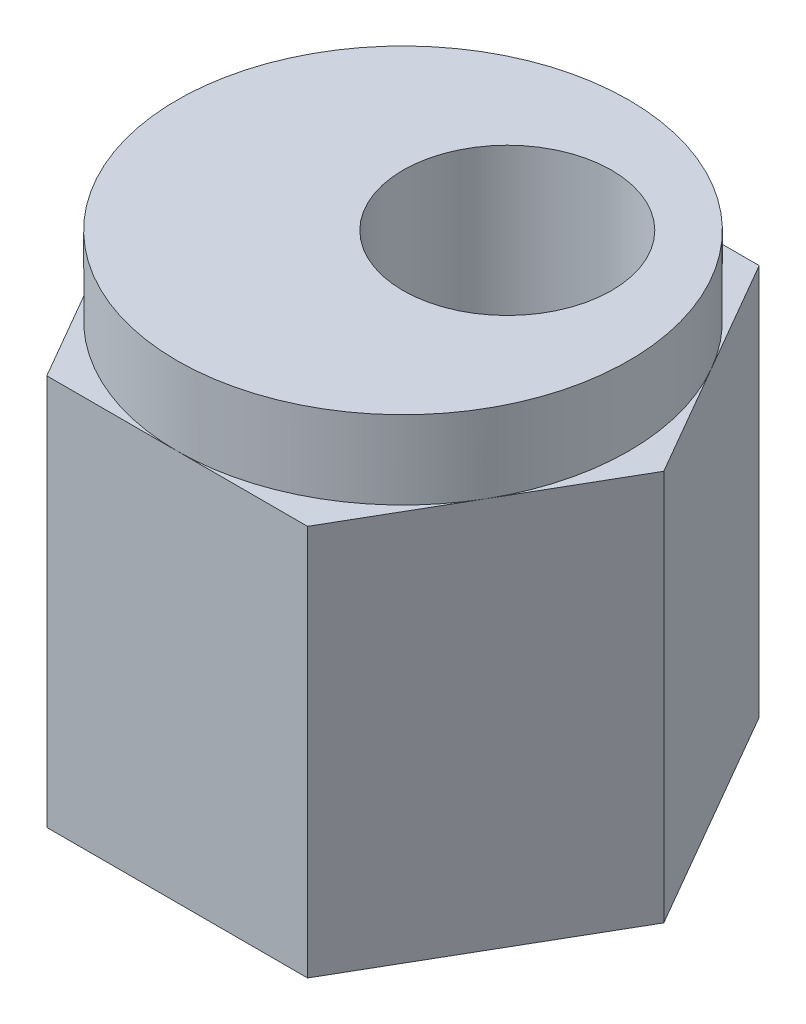
ISO-10303-21;
HEADER;
FILE_DESCRIPTION(('STEP AP214'),'2;1');
FILE_NAME('part.step','',(''),(''),'','','');
FILE_SCHEMA(('AUTOMOTIVE_DESIGN { 1 0 10303 214 1 1 1 1 }'));
ENDSEC;
DATA;
#1=APPLICATION_CONTEXT('core data for automotive mechanical design processes');
#2=APPLICATION_PROTOCOL_DEFINITION('international standard','automotive_design',2000,#1);
#3=PRODUCT_CONTEXT('',#1,'mechanical');
#4=PRODUCT('Part','Part','',(#3));
#5=PRODUCT_RELATED_PRODUCT_CATEGORY('part','',(#4));
#6=PRODUCT_DEFINITION_FORMATION('','',#4);
#7=PRODUCT_DEFINITION_CONTEXT('part definition',#1,'design');
#8=PRODUCT_DEFINITION('design','',#6,#7);
#9=PRODUCT_DEFINITION_SHAPE('','',#8);
#10=(LENGTH_UNIT() NAMED_UNIT(*) SI_UNIT(.MILLI.,.METRE.));
#11=(NAMED_UNIT(*) PLANE_ANGLE_UNIT() SI_UNIT($,.RADIAN.));
#12=(NAMED_UNIT(*) SI_UNIT($,.STERADIAN.) SOLID_ANGLE_UNIT());
#13=UNCERTAINTY_MEASURE_WITH_UNIT(LENGTH_MEASURE(1.E-05),#10,'distance_accuracy_value','');
#14=(GEOMETRIC_REPRESENTATION_CONTEXT(3) GLOBAL_UNCERTAINTY_ASSIGNED_CONTEXT((#13)) GLOBAL_UNIT_ASSIGNED_CONTEXT((#10,
#11,#12)) REPRESENTATION_CONTEXT('',''));
#15=CARTESIAN_POINT('',(0.,0.,0.));
#16=DIRECTION('',(0.,0.,1.));
#17=DIRECTION('',(1.,0.,0.));
#18=AXIS2_PLACEMENT_3D('',#15,#16,#17);
#19=CARTESIAN_POINT('',(0.,18.,0.));
#20=DIRECTION('',(0.,1.,0.));
#21=DIRECTION('',(0.,0.,1.));
#22=AXIS2_PLACEMENT_3D('',#19,#20,#21);
#23=PLANE('',#22);
#24=CARTESIAN_POINT('',(2.,18.,-2.));
#25=DIRECTION('',(0.,1.,0.));
#26=DIRECTION('',(0.,0.,1.));
#27=AXIS2_PLACEMENT_3D('',#24,#25,#26);
#28=CIRCLE('',#27,4.);
#29=CARTESIAN_POINT('',(2.,18.,2.));
#30=VERTEX_POINT('',#29);
#31=EDGE_CURVE('E133',#30,#30,#28,.T.);
#32=ORIENTED_EDGE('',*,*,#31,.F.);
#33=EDGE_LOOP('',(#32));
#34=FACE_BOUND('',#33,.T.);
#35=CARTESIAN_POINT('',(0.,18.,0.));
#36=DIRECTION('',(0.,1.,0.));
#37=DIRECTION('',(0.,0.,1.));
#38=AXIS2_PLACEMENT_3D('',#35,#36,#37);
#39=CIRCLE('',#38,8.66025403784443);
#40=CARTESIAN_POINT('',(0.,18.,8.66025403784443));
#41=VERTEX_POINT('',#40);
#42=EDGE_CURVE('E189',#41,#41,#39,.T.);
#43=ORIENTED_EDGE('',*,*,#42,.T.);
#44=EDGE_LOOP('',(#43));
#45=FACE_BOUND('',#44,.T.);
#46=ADVANCED_FACE('F32',(#34,#45),#23,.T.);
#47=CARTESIAN_POINT('',(5.00000000000009,18.,8.66025403784431));
#48=DIRECTION('',(-0.866025403784442,0.,-0.499999999999995));
#49=DIRECTION('',(-0.499999999999995,0.,0.866025403784442));
#50=AXIS2_PLACEMENT_3D('',#47,#48,#49);
#51=PLANE('',#50);
#52=DIRECTION('',(0.499999999999995,0.,-0.866025403784442));
#53=VECTOR('',#52,1.);
#54=CARTESIAN_POINT('',(5.00000000000009,15.,8.66025403784431));
#55=LINE('',#54,#53);
#56=CARTESIAN_POINT('',(5.00000000000009,15.,8.66025403784431));
#57=VERTEX_POINT('',#56);
#58=CARTESIAN_POINT('',(7.50000000000006,15.,4.33012701892217));
#59=VERTEX_POINT('',#58);
#60=EDGE_CURVE('E102',#57,#59,#55,.T.);
#61=ORIENTED_EDGE('',*,*,#60,.F.);
#62=DIRECTION('',(0.,-1.,0.));
#63=VECTOR('',#62,1.);
#64=CARTESIAN_POINT('',(5.00000000000009,18.,8.66025403784431));
#65=LINE('',#64,#63);
#66=CARTESIAN_POINT('',(5.00000000000009,0.,8.66025403784431));
#67=VERTEX_POINT('',#66);
#68=EDGE_CURVE('E55',#57,#67,#65,.T.);
#69=ORIENTED_EDGE('',*,*,#68,.T.);
#70=DIRECTION('',(0.499999999999995,0.,-0.866025403784441));
#71=VECTOR('',#70,1.);
#72=CARTESIAN_POINT('',(5.00000000000009,0.,8.66025403784431));
#73=LINE('',#72,#71);
#74=CARTESIAN_POINT('',(9.99999999999998,0.,0.));
#75=VERTEX_POINT('',#74);
#76=EDGE_CURVE('E136',#67,#75,#73,.T.);
#77=ORIENTED_EDGE('',*,*,#76,.T.);
#78=DIRECTION('',(0.,-1.,0.));
#79=VECTOR('',#78,1.);
#80=CARTESIAN_POINT('',(9.99999999999998,18.,0.));
#81=LINE('',#80,#79);
#82=CARTESIAN_POINT('',(9.99999999999998,15.,0.));
#83=VERTEX_POINT('',#82);
#84=EDGE_CURVE('E128',#83,#75,#81,.T.);
#85=ORIENTED_EDGE('',*,*,#84,.F.);
#86=EDGE_CURVE('E108',#59,#83,#55,.T.);
#87=ORIENTED_EDGE('',*,*,#86,.F.);
#88=EDGE_LOOP('',(#61,#69,#77,#85,#87));
#89=FACE_BOUND('',#88,.T.);
#90=ADVANCED_FACE('F34',(#89),#51,.F.);
#91=CARTESIAN_POINT('',(9.99999999999998,18.,0.));
#92=DIRECTION('',(-0.866025403784438,0.,0.500000000000001));
#93=DIRECTION('',(0.500000000000001,0.,0.866025403784438));
#94=AXIS2_PLACEMENT_3D('',#91,#92,#93);
#95=PLANE('',#94);
#96=DIRECTION('',(-0.500000000000001,0.,-0.866025403784438));
#97=VECTOR('',#96,1.);
#98=CARTESIAN_POINT('',(9.99999999999998,15.,0.));
#99=LINE('',#98,#97);
#100=CARTESIAN_POINT('',(7.50000000000003,15.,-4.33012701892222));
#101=VERTEX_POINT('',#100);
#102=EDGE_CURVE('E115',#83,#101,#99,.T.);
#103=ORIENTED_EDGE('',*,*,#102,.F.);
#104=ORIENTED_EDGE('',*,*,#84,.T.);
#105=DIRECTION('',(-0.500000000000001,0.,-0.866025403784438));
#106=VECTOR('',#105,1.);
#107=CARTESIAN_POINT('',(9.99999999999998,0.,0.));
#108=LINE('',#107,#106);
#109=CARTESIAN_POINT('',(4.99999999999997,0.,-8.66025403784438));
#110=VERTEX_POINT('',#109);
#111=EDGE_CURVE('E140',#75,#110,#108,.T.);
#112=ORIENTED_EDGE('',*,*,#111,.T.);
#113=DIRECTION('',(0.,-1.,0.));
#114=VECTOR('',#113,1.);
#115=CARTESIAN_POINT('',(4.99999999999997,18.,-8.66025403784438));
#116=LINE('',#115,#114);
#117=CARTESIAN_POINT('',(4.99999999999997,15.,-8.66025403784438));
#118=VERTEX_POINT('',#117);
#119=EDGE_CURVE('E161',#118,#110,#116,.T.);
#120=ORIENTED_EDGE('',*,*,#119,.F.);
#121=EDGE_CURVE('E129',#101,#118,#99,.T.);
#122=ORIENTED_EDGE('',*,*,#121,.F.);
#123=EDGE_LOOP('',(#103,#104,#112,#120,#122));
#124=FACE_BOUND('',#123,.T.);
#125=ADVANCED_FACE('F164',(#124),#95,.F.);
#126=CARTESIAN_POINT('',(4.99999999999997,18.,-8.66025403784438));
#127=DIRECTION('',(0.,0.,1.));
#128=DIRECTION('',(1.,0.,0.));
#129=AXIS2_PLACEMENT_3D('',#126,#127,#128);
#130=PLANE('',#129);
#131=DIRECTION('',(-1.,0.,0.));
#132=VECTOR('',#131,1.);
#133=CARTESIAN_POINT('',(4.99999999999997,15.,-8.66025403784438));
#134=LINE('',#133,#132);
#135=CARTESIAN_POINT('',(0.,15.,-8.66025403784443));
#136=VERTEX_POINT('',#135);
#137=EDGE_CURVE('E179',#118,#136,#134,.T.);
#138=ORIENTED_EDGE('',*,*,#137,.F.);
#139=ORIENTED_EDGE('',*,*,#119,.T.);
#140=DIRECTION('',(-1.,0.,0.));
#141=VECTOR('',#140,1.);
#142=CARTESIAN_POINT('',(4.99999999999997,0.,-8.66025403784438));
#143=LINE('',#142,#141);
#144=CARTESIAN_POINT('',(-5.00000000000003,0.,-8.66025403784435));
#145=VERTEX_POINT('',#144);
#146=EDGE_CURVE('E143',#110,#145,#143,.T.);
#147=ORIENTED_EDGE('',*,*,#146,.T.);
#148=DIRECTION('',(0.,-1.,0.));
#149=VECTOR('',#148,1.);
#150=CARTESIAN_POINT('',(-5.00000000000003,18.,-8.66025403784435));
#151=LINE('',#150,#149);
#152=CARTESIAN_POINT('',(-5.00000000000003,15.,-8.66025403784435));
#153=VERTEX_POINT('',#152);
#154=EDGE_CURVE('E159',#153,#145,#151,.T.);
#155=ORIENTED_EDGE('',*,*,#154,.F.);
#156=EDGE_CURVE('E181',#136,#153,#134,.T.);
#157=ORIENTED_EDGE('',*,*,#156,.F.);
#158=EDGE_LOOP('',(#138,#139,#147,#155,#157));
#159=FACE_BOUND('',#158,.T.);
#160=ADVANCED_FACE('F177',(#159),#130,.F.);
#161=CARTESIAN_POINT('',(-5.00000000000003,18.,-8.66025403784435));
#162=DIRECTION('',(0.866025403784441,0.,0.499999999999995));
#163=DIRECTION('',(0.499999999999995,0.,-0.866025403784442));
#164=AXIS2_PLACEMENT_3D('',#161,#162,#163);
#165=PLANE('',#164);
#166=DIRECTION('',(-0.499999999999995,0.,0.866025403784442));
#167=VECTOR('',#166,1.);
#168=CARTESIAN_POINT('',(-5.00000000000003,15.,-8.66025403784435));
#169=LINE('',#168,#167);
#170=CARTESIAN_POINT('',(-7.50000000000006,15.,-4.33012701892217));
#171=VERTEX_POINT('',#170);
#172=EDGE_CURVE('E183',#153,#171,#169,.T.);
#173=ORIENTED_EDGE('',*,*,#172,.F.);
#174=ORIENTED_EDGE('',*,*,#154,.T.);
#175=DIRECTION('',(-0.499999999999995,0.,0.866025403784442));
#176=VECTOR('',#175,1.);
#177=CARTESIAN_POINT('',(-5.00000000000003,0.,-8.66025403784435));
#178=LINE('',#177,#176);
#179=CARTESIAN_POINT('',(-9.99999999999998,0.,0.));
#180=VERTEX_POINT('',#179);
#181=EDGE_CURVE('E146',#145,#180,#178,.T.);
#182=ORIENTED_EDGE('',*,*,#181,.T.);
#183=DIRECTION('',(0.,-1.,0.));
#184=VECTOR('',#183,1.);
#185=CARTESIAN_POINT('',(-9.99999999999998,18.,0.));
#186=LINE('',#185,#184);
#187=CARTESIAN_POINT('',(-9.99999999999998,15.,0.));
#188=VERTEX_POINT('',#187);
#189=EDGE_CURVE('E157',#188,#180,#186,.T.);
#190=ORIENTED_EDGE('',*,*,#189,.F.);
#191=EDGE_CURVE('E185',#171,#188,#169,.T.);
#192=ORIENTED_EDGE('',*,*,#191,.F.);
#193=EDGE_LOOP('',(#173,#174,#182,#190,#192));
#194=FACE_BOUND('',#193,.T.);
#195=ADVANCED_FACE('F203',(#194),#165,.F.);
#196=CARTESIAN_POINT('',(-9.99999999999998,18.,0.));
#197=DIRECTION('',(0.866025403784434,0.,-0.500000000000007));
#198=DIRECTION('',(-0.500000000000007,0.,-0.866025403784435));
#199=AXIS2_PLACEMENT_3D('',#196,#197,#198);
#200=PLANE('',#199);
#201=DIRECTION('',(0.500000000000007,0.,0.866025403784435));
#202=VECTOR('',#201,1.);
#203=CARTESIAN_POINT('',(-9.99999999999998,15.,0.));
#204=LINE('',#203,#202);
#205=CARTESIAN_POINT('',(-7.5,15.,4.33012701892228));
#206=VERTEX_POINT('',#205);
#207=EDGE_CURVE('E187',#188,#206,#204,.T.);
#208=ORIENTED_EDGE('',*,*,#207,.F.);
#209=ORIENTED_EDGE('',*,*,#189,.T.);
#210=DIRECTION('',(0.500000000000007,0.,0.866025403784434));
#211=VECTOR('',#210,1.);
#212=CARTESIAN_POINT('',(-9.99999999999998,0.,0.));
#213=LINE('',#212,#211);
#214=CARTESIAN_POINT('',(-4.99999999999991,0.,8.66025403784442));
#215=VERTEX_POINT('',#214);
#216=EDGE_CURVE('E149',#180,#215,#213,.T.);
#217=ORIENTED_EDGE('',*,*,#216,.T.);
#218=DIRECTION('',(0.,-1.,0.));
#219=VECTOR('',#218,1.);
#220=CARTESIAN_POINT('',(-4.99999999999991,18.,8.66025403784442));
#221=LINE('',#220,#219);
#222=CARTESIAN_POINT('',(-4.99999999999991,15.,8.66025403784442));
#223=VERTEX_POINT('',#222);
#224=EDGE_CURVE('E155',#223,#215,#221,.T.);
#225=ORIENTED_EDGE('',*,*,#224,.F.);
#226=EDGE_CURVE('E126',#206,#223,#204,.T.);
#227=ORIENTED_EDGE('',*,*,#226,.F.);
#228=EDGE_LOOP('',(#208,#209,#217,#225,#227));
#229=FACE_BOUND('',#228,.T.);
#230=ADVANCED_FACE('F209',(#229),#200,.F.);
#231=CARTESIAN_POINT('',(-4.99999999999991,18.,8.66025403784442));
#232=DIRECTION('',(0.,0.,-1.));
#233=DIRECTION('',(-1.,0.,0.));
#234=AXIS2_PLACEMENT_3D('',#231,#232,#233);
#235=PLANE('',#234);
#236=DIRECTION('',(1.,0.,0.));
#237=VECTOR('',#236,1.);
#238=CARTESIAN_POINT('',(-4.99999999999991,15.,8.66025403784442));
#239=LINE('',#238,#237);
#240=CARTESIAN_POINT('',(0.,15.,8.6602540378444));
#241=VERTEX_POINT('',#240);
#242=EDGE_CURVE('E11',#223,#241,#239,.T.);
#243=ORIENTED_EDGE('',*,*,#242,.F.);
#244=ORIENTED_EDGE('',*,*,#224,.T.);
#245=DIRECTION('',(1.,0.,0.));
#246=VECTOR('',#245,1.);
#247=CARTESIAN_POINT('',(-4.99999999999991,0.,8.66025403784442));
#248=LINE('',#247,#246);
#249=EDGE_CURVE('E152',#215,#67,#248,.T.);
#250=ORIENTED_EDGE('',*,*,#249,.T.);
#251=ORIENTED_EDGE('',*,*,#68,.F.);
#252=EDGE_CURVE('E36',#241,#57,#239,.T.);
#253=ORIENTED_EDGE('',*,*,#252,.F.);
#254=EDGE_LOOP('',(#243,#244,#250,#251,#253));
#255=FACE_BOUND('',#254,.T.);
#256=ADVANCED_FACE('F215',(#255),#235,.F.);
#257=CARTESIAN_POINT('',(0.,0.,0.));
#258=DIRECTION('',(0.,1.,0.));
#259=DIRECTION('',(0.,0.,1.));
#260=AXIS2_PLACEMENT_3D('',#257,#258,#259);
#261=PLANE('',#260);
#262=ORIENTED_EDGE('',*,*,#76,.F.);
#263=ORIENTED_EDGE('',*,*,#249,.F.);
#264=ORIENTED_EDGE('',*,*,#216,.F.);
#265=ORIENTED_EDGE('',*,*,#181,.F.);
#266=ORIENTED_EDGE('',*,*,#146,.F.);
#267=ORIENTED_EDGE('',*,*,#111,.F.);
#268=EDGE_LOOP('',(#262,#263,#264,#265,#266,#267));
#269=FACE_BOUND('',#268,.T.);
#270=CARTESIAN_POINT('',(2.,0.,-2.));
#271=DIRECTION('',(0.,1.,0.));
#272=DIRECTION('',(0.,0.,1.));
#273=AXIS2_PLACEMENT_3D('',#270,#271,#272);
#274=CIRCLE('',#273,4.);
#275=CARTESIAN_POINT('',(2.,0.,2.));
#276=VERTEX_POINT('',#275);
#277=EDGE_CURVE('E107',#276,#276,#274,.T.);
#278=ORIENTED_EDGE('',*,*,#277,.T.);
#279=EDGE_LOOP('',(#278));
#280=FACE_BOUND('',#279,.T.);
#281=ADVANCED_FACE('F169',(#269,#280),#261,.F.);
#282=CARTESIAN_POINT('',(2.,18.,-2.));
#283=DIRECTION('',(0.,-1.,0.));
#284=DIRECTION('',(0.,0.,-1.));
#285=AXIS2_PLACEMENT_3D('',#282,#283,#284);
#286=CYLINDRICAL_SURFACE('',#285,4.);
#287=ORIENTED_EDGE('',*,*,#31,.T.);
#288=EDGE_LOOP('',(#287));
#289=FACE_BOUND('',#288,.T.);
#290=ORIENTED_EDGE('',*,*,#277,.F.);
#291=EDGE_LOOP('',(#290));
#292=FACE_BOUND('',#291,.T.);
#293=ADVANCED_FACE('F222',(#289,#292),#286,.F.);
#294=CARTESIAN_POINT('',(0.,15.,0.));
#295=DIRECTION('',(0.,1.,0.));
#296=DIRECTION('',(0.,0.,1.));
#297=AXIS2_PLACEMENT_3D('',#294,#295,#296);
#298=PLANE('',#297);
#299=ORIENTED_EDGE('',*,*,#60,.T.);
#300=CARTESIAN_POINT('',(0.,15.,0.));
#301=DIRECTION('',(0.,1.,0.));
#302=DIRECTION('',(0.,0.,1.));
#303=AXIS2_PLACEMENT_3D('',#300,#301,#302);
#304=CIRCLE('',#303,8.66025403784443);
#305=EDGE_CURVE('E47',#241,#59,#304,.T.);
#306=ORIENTED_EDGE('',*,*,#305,.F.);
#307=ORIENTED_EDGE('',*,*,#252,.T.);
#308=EDGE_LOOP('',(#299,#306,#307));
#309=FACE_BOUND('',#308,.T.);
#310=ADVANCED_FACE('F104',(#309),#298,.T.);
#311=ORIENTED_EDGE('',*,*,#86,.T.);
#312=ORIENTED_EDGE('',*,*,#102,.T.);
#313=EDGE_CURVE('E112',#59,#101,#304,.T.);
#314=ORIENTED_EDGE('',*,*,#313,.F.);
#315=EDGE_LOOP('',(#311,#312,#314));
#316=FACE_BOUND('',#315,.T.);
#317=ADVANCED_FACE('F113',(#316),#298,.T.);
#318=ORIENTED_EDGE('',*,*,#121,.T.);
#319=ORIENTED_EDGE('',*,*,#137,.T.);
#320=EDGE_CURVE('E120',#101,#136,#304,.T.);
#321=ORIENTED_EDGE('',*,*,#320,.F.);
#322=EDGE_LOOP('',(#318,#319,#321));
#323=FACE_BOUND('',#322,.T.);
#324=ADVANCED_FACE('F249',(#323),#298,.T.);
#325=ORIENTED_EDGE('',*,*,#156,.T.);
#326=ORIENTED_EDGE('',*,*,#172,.T.);
#327=EDGE_CURVE('E194',#136,#171,#304,.T.);
#328=ORIENTED_EDGE('',*,*,#327,.F.);
#329=EDGE_LOOP('',(#325,#326,#328));
#330=FACE_BOUND('',#329,.T.);
#331=ADVANCED_FACE('F201',(#330),#298,.T.);
#332=ORIENTED_EDGE('',*,*,#191,.T.);
#333=ORIENTED_EDGE('',*,*,#207,.T.);
#334=EDGE_CURVE('E193',#171,#206,#304,.T.);
#335=ORIENTED_EDGE('',*,*,#334,.F.);
#336=EDGE_LOOP('',(#332,#333,#335));
#337=FACE_BOUND('',#336,.T.);
#338=ADVANCED_FACE('F207',(#337),#298,.T.);
#339=ORIENTED_EDGE('',*,*,#226,.T.);
#340=ORIENTED_EDGE('',*,*,#242,.T.);
#341=EDGE_CURVE('E125',#206,#241,#304,.T.);
#342=ORIENTED_EDGE('',*,*,#341,.F.);
#343=EDGE_LOOP('',(#339,#340,#342));
#344=FACE_BOUND('',#343,.T.);
#345=ADVANCED_FACE('F213',(#344),#298,.T.);
#346=CARTESIAN_POINT('',(0.,15.,0.));
#347=DIRECTION('',(0.,1.,0.));
#348=DIRECTION('',(0.,0.,1.));
#349=AXIS2_PLACEMENT_3D('',#346,#347,#348);
#350=CYLINDRICAL_SURFACE('',#349,8.66025403784443);
#351=ORIENTED_EDGE('',*,*,#42,.F.);
#352=EDGE_LOOP('',(#351));
#353=FACE_BOUND('',#352,.T.);
#354=ORIENTED_EDGE('',*,*,#305,.T.);
#355=ORIENTED_EDGE('',*,*,#313,.T.);
#356=ORIENTED_EDGE('',*,*,#320,.T.);
#357=ORIENTED_EDGE('',*,*,#327,.T.);
#358=ORIENTED_EDGE('',*,*,#334,.T.);
#359=ORIENTED_EDGE('',*,*,#341,.T.);
#360=EDGE_LOOP('',(#354,#355,#356,#357,#358,#359));
#361=FACE_BOUND('',#360,.T.);
#362=ADVANCED_FACE('F122',(#353,#361),#350,.T.);
#363=CLOSED_SHELL('',(#46,#90,#125,#160,#195,#230,#256,#281,#293,#310,#317,#324,#331,#338,#345,#362));
#364=MANIFOLD_SOLID_BREP('B2',#363);
#365=ADVANCED_BREP_SHAPE_REPRESENTATION('',(#18,#364),#14);
#366=SHAPE_DEFINITION_REPRESENTATION(#9,#365);
ENDSEC;
END-ISO-10303-21;
